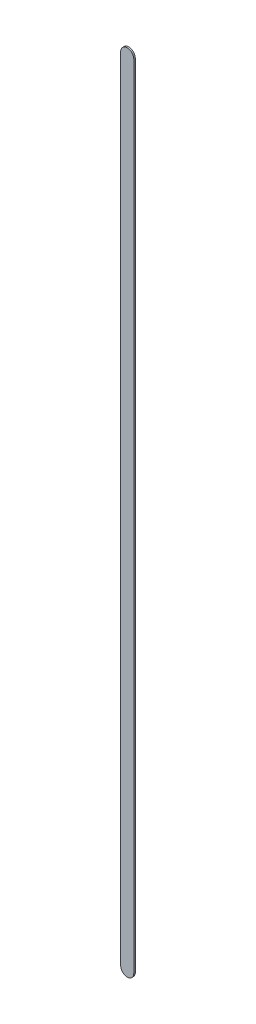
ISO-10303-21;
HEADER;
FILE_DESCRIPTION(('STEP AP214'),'2;1');
FILE_NAME('part.step','',(''),(''),'','','');
FILE_SCHEMA(('AUTOMOTIVE_DESIGN { 1 0 10303 214 1 1 1 1 }'));
ENDSEC;
DATA;
#1=APPLICATION_CONTEXT('core data for automotive mechanical design processes');
#2=APPLICATION_PROTOCOL_DEFINITION('international standard','automotive_design',2000,#1);
#3=PRODUCT_CONTEXT('',#1,'mechanical');
#4=PRODUCT('Part','Part','',(#3));
#5=PRODUCT_RELATED_PRODUCT_CATEGORY('part','',(#4));
#6=PRODUCT_DEFINITION_FORMATION('','',#4);
#7=PRODUCT_DEFINITION_CONTEXT('part definition',#1,'design');
#8=PRODUCT_DEFINITION('design','',#6,#7);
#9=PRODUCT_DEFINITION_SHAPE('','',#8);
#10=(LENGTH_UNIT() NAMED_UNIT(*) SI_UNIT(.MILLI.,.METRE.));
#11=(NAMED_UNIT(*) PLANE_ANGLE_UNIT() SI_UNIT($,.RADIAN.));
#12=(NAMED_UNIT(*) SI_UNIT($,.STERADIAN.) SOLID_ANGLE_UNIT());
#13=UNCERTAINTY_MEASURE_WITH_UNIT(LENGTH_MEASURE(1.E-05),#10,'distance_accuracy_value','');
#14=(GEOMETRIC_REPRESENTATION_CONTEXT(3) GLOBAL_UNCERTAINTY_ASSIGNED_CONTEXT((#13)) GLOBAL_UNIT_ASSIGNED_CONTEXT((#10,
#11,#12)) REPRESENTATION_CONTEXT('',''));
#15=CARTESIAN_POINT('',(0.,0.,0.));
#16=DIRECTION('',(0.,0.,1.));
#17=DIRECTION('',(1.,0.,0.));
#18=AXIS2_PLACEMENT_3D('',#15,#16,#17);
#19=CARTESIAN_POINT('',(75.44,-92.81,1.635));
#20=DIRECTION('',(0.,0.,1.));
#21=DIRECTION('',(1.,0.,0.));
#22=AXIS2_PLACEMENT_3D('',#19,#20,#21);
#23=PLANE('',#22);
#24=DIRECTION('',(0.,-1.,0.));
#25=VECTOR('',#24,1.);
#26=CARTESIAN_POINT('',(75.44,-92.81,1.635));
#27=LINE('',#26,#25);
#28=CARTESIAN_POINT('',(75.44,-92.81,1.635));
#29=VERTEX_POINT('',#28);
#30=CARTESIAN_POINT('',(75.44,-110.99,1.635));
#31=VERTEX_POINT('',#30);
#32=EDGE_CURVE('E81',#29,#31,#27,.T.);
#33=ORIENTED_EDGE('',*,*,#32,.T.);
#34=CARTESIAN_POINT('',(75.59,-110.99,1.635));
#35=DIRECTION('',(0.,0.,1.));
#36=DIRECTION('',(-1.,0.,0.));
#37=AXIS2_PLACEMENT_3D('',#34,#35,#36);
#38=CIRCLE('',#37,0.15);
#39=CARTESIAN_POINT('',(75.74,-110.99,1.635));
#40=VERTEX_POINT('',#39);
#41=EDGE_CURVE('E105',#31,#40,#38,.T.);
#42=ORIENTED_EDGE('',*,*,#41,.T.);
#43=DIRECTION('',(0.,1.,0.));
#44=VECTOR('',#43,1.);
#45=CARTESIAN_POINT('',(75.74,-110.99,1.635));
#46=LINE('',#45,#44);
#47=CARTESIAN_POINT('',(75.74,-92.81,1.635));
#48=VERTEX_POINT('',#47);
#49=EDGE_CURVE('E74',#40,#48,#46,.T.);
#50=ORIENTED_EDGE('',*,*,#49,.T.);
#51=CARTESIAN_POINT('',(75.59,-92.81,1.635));
#52=DIRECTION('',(0.,0.,1.));
#53=DIRECTION('',(1.,0.,0.));
#54=AXIS2_PLACEMENT_3D('',#51,#52,#53);
#55=CIRCLE('',#54,0.15);
#56=EDGE_CURVE('E11',#48,#29,#55,.T.);
#57=ORIENTED_EDGE('',*,*,#56,.T.);
#58=EDGE_LOOP('',(#33,#42,#50,#57));
#59=FACE_BOUND('',#58,.T.);
#60=ADVANCED_FACE('F17',(#59),#23,.T.);
#61=CARTESIAN_POINT('',(75.44,-92.81,1.6));
#62=DIRECTION('',(0.,0.,1.));
#63=DIRECTION('',(1.,0.,0.));
#64=AXIS2_PLACEMENT_3D('',#61,#62,#63);
#65=PLANE('',#64);
#66=CARTESIAN_POINT('',(75.59,-92.81,1.6));
#67=DIRECTION('',(0.,0.,1.));
#68=DIRECTION('',(1.,0.,0.));
#69=AXIS2_PLACEMENT_3D('',#66,#67,#68);
#70=CIRCLE('',#69,0.15);
#71=CARTESIAN_POINT('',(75.74,-92.81,1.6));
#72=VERTEX_POINT('',#71);
#73=CARTESIAN_POINT('',(75.44,-92.81,1.6));
#74=VERTEX_POINT('',#73);
#75=EDGE_CURVE('E25',#72,#74,#70,.T.);
#76=ORIENTED_EDGE('',*,*,#75,.F.);
#77=DIRECTION('',(0.,1.,0.));
#78=VECTOR('',#77,1.);
#79=CARTESIAN_POINT('',(75.74,-110.99,1.6));
#80=LINE('',#79,#78);
#81=CARTESIAN_POINT('',(75.74,-110.99,1.6));
#82=VERTEX_POINT('',#81);
#83=EDGE_CURVE('E109',#82,#72,#80,.T.);
#84=ORIENTED_EDGE('',*,*,#83,.F.);
#85=CARTESIAN_POINT('',(75.59,-110.99,1.6));
#86=DIRECTION('',(0.,0.,1.));
#87=DIRECTION('',(-1.,0.,0.));
#88=AXIS2_PLACEMENT_3D('',#85,#86,#87);
#89=CIRCLE('',#88,0.15);
#90=CARTESIAN_POINT('',(75.44,-110.99,1.6));
#91=VERTEX_POINT('',#90);
#92=EDGE_CURVE('E83',#91,#82,#89,.T.);
#93=ORIENTED_EDGE('',*,*,#92,.F.);
#94=DIRECTION('',(0.,-1.,0.));
#95=VECTOR('',#94,1.);
#96=CARTESIAN_POINT('',(75.44,-92.81,1.6));
#97=LINE('',#96,#95);
#98=EDGE_CURVE('E79',#74,#91,#97,.T.);
#99=ORIENTED_EDGE('',*,*,#98,.F.);
#100=EDGE_LOOP('',(#76,#84,#93,#99));
#101=FACE_BOUND('',#100,.T.);
#102=ADVANCED_FACE('F85',(#101),#65,.F.);
#103=CARTESIAN_POINT('',(75.59,-92.81,1.6));
#104=DIRECTION('',(0.,0.,-1.));
#105=DIRECTION('',(1.,0.,0.));
#106=AXIS2_PLACEMENT_3D('',#103,#104,#105);
#107=CYLINDRICAL_SURFACE('',#106,0.15);
#108=ORIENTED_EDGE('',*,*,#75,.T.);
#109=DIRECTION('',(0.,0.,1.));
#110=VECTOR('',#109,1.);
#111=CARTESIAN_POINT('',(75.44,-92.81,1.6));
#112=LINE('',#111,#110);
#113=EDGE_CURVE('E68',#74,#29,#112,.T.);
#114=ORIENTED_EDGE('',*,*,#113,.T.);
#115=ORIENTED_EDGE('',*,*,#56,.F.);
#116=DIRECTION('',(0.,0.,1.));
#117=VECTOR('',#116,1.);
#118=CARTESIAN_POINT('',(75.74,-92.81,1.6));
#119=LINE('',#118,#117);
#120=EDGE_CURVE('E71',#72,#48,#119,.T.);
#121=ORIENTED_EDGE('',*,*,#120,.F.);
#122=EDGE_LOOP('',(#108,#114,#115,#121));
#123=FACE_BOUND('',#122,.T.);
#124=ADVANCED_FACE('F67',(#123),#107,.T.);
#125=CARTESIAN_POINT('',(75.74,-110.99,1.6));
#126=DIRECTION('',(-1.,0.,0.));
#127=DIRECTION('',(0.,0.,1.));
#128=AXIS2_PLACEMENT_3D('',#125,#126,#127);
#129=PLANE('',#128);
#130=ORIENTED_EDGE('',*,*,#83,.T.);
#131=ORIENTED_EDGE('',*,*,#120,.T.);
#132=ORIENTED_EDGE('',*,*,#49,.F.);
#133=DIRECTION('',(0.,0.,1.));
#134=VECTOR('',#133,1.);
#135=CARTESIAN_POINT('',(75.74,-110.99,1.6));
#136=LINE('',#135,#134);
#137=EDGE_CURVE('E101',#82,#40,#136,.T.);
#138=ORIENTED_EDGE('',*,*,#137,.F.);
#139=EDGE_LOOP('',(#130,#131,#132,#138));
#140=FACE_BOUND('',#139,.T.);
#141=ADVANCED_FACE('F120',(#140),#129,.F.);
#142=CARTESIAN_POINT('',(75.59,-110.99,1.6));
#143=DIRECTION('',(0.,0.,-1.));
#144=DIRECTION('',(-1.,0.,0.));
#145=AXIS2_PLACEMENT_3D('',#142,#143,#144);
#146=CYLINDRICAL_SURFACE('',#145,0.15);
#147=ORIENTED_EDGE('',*,*,#92,.T.);
#148=ORIENTED_EDGE('',*,*,#137,.T.);
#149=ORIENTED_EDGE('',*,*,#41,.F.);
#150=DIRECTION('',(0.,0.,1.));
#151=VECTOR('',#150,1.);
#152=CARTESIAN_POINT('',(75.44,-110.99,1.6));
#153=LINE('',#152,#151);
#154=EDGE_CURVE('E89',#91,#31,#153,.T.);
#155=ORIENTED_EDGE('',*,*,#154,.F.);
#156=EDGE_LOOP('',(#147,#148,#149,#155));
#157=FACE_BOUND('',#156,.T.);
#158=ADVANCED_FACE('F122',(#157),#146,.T.);
#159=CARTESIAN_POINT('',(75.44,-92.81,1.6));
#160=DIRECTION('',(1.,0.,0.));
#161=DIRECTION('',(0.,1.,0.));
#162=AXIS2_PLACEMENT_3D('',#159,#160,#161);
#163=PLANE('',#162);
#164=ORIENTED_EDGE('',*,*,#98,.T.);
#165=ORIENTED_EDGE('',*,*,#154,.T.);
#166=ORIENTED_EDGE('',*,*,#32,.F.);
#167=ORIENTED_EDGE('',*,*,#113,.F.);
#168=EDGE_LOOP('',(#164,#165,#166,#167));
#169=FACE_BOUND('',#168,.T.);
#170=ADVANCED_FACE('F77',(#169),#163,.F.);
#171=CLOSED_SHELL('',(#60,#102,#124,#141,#158,#170));
#172=MANIFOLD_SOLID_BREP('B1',#171);
#173=ADVANCED_BREP_SHAPE_REPRESENTATION('',(#18,#172),#14);
#174=SHAPE_DEFINITION_REPRESENTATION(#9,#173);
ENDSEC;
END-ISO-10303-21;
